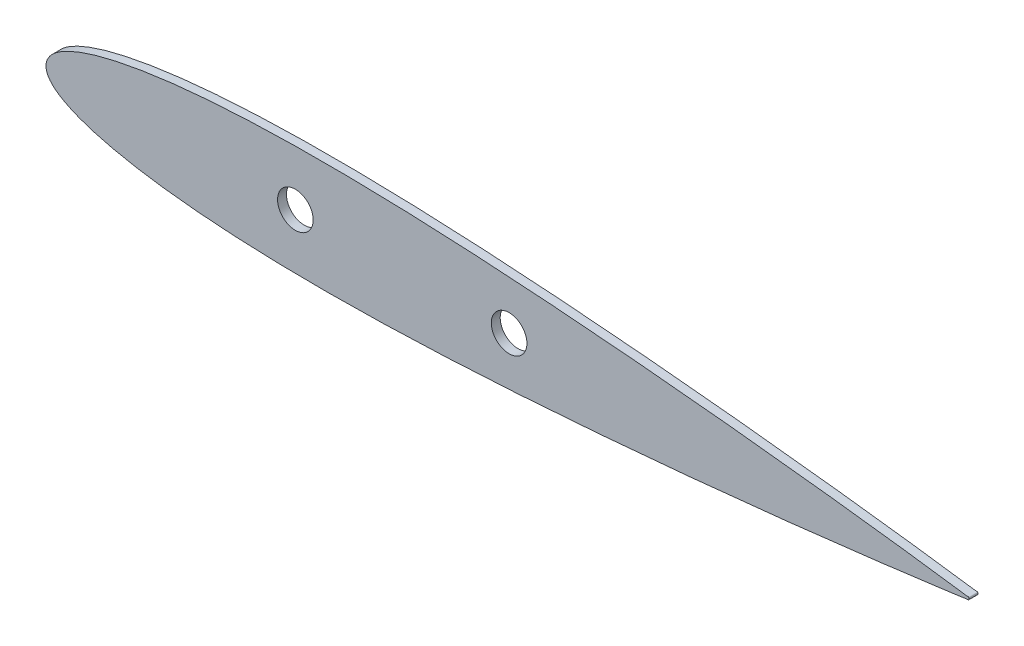
ISO-10303-21;
HEADER;
FILE_DESCRIPTION(('STEP AP214'),'2;1');
FILE_NAME('part.step','',(''),(''),'','','');
FILE_SCHEMA(('AUTOMOTIVE_DESIGN { 1 0 10303 214 1 1 1 1 }'));
ENDSEC;
DATA;
#1=APPLICATION_CONTEXT('core data for automotive mechanical design processes');
#2=APPLICATION_PROTOCOL_DEFINITION('international standard','automotive_design',2000,#1);
#3=PRODUCT_CONTEXT('',#1,'mechanical');
#4=PRODUCT('Part','Part','',(#3));
#5=PRODUCT_RELATED_PRODUCT_CATEGORY('part','',(#4));
#6=PRODUCT_DEFINITION_FORMATION('','',#4);
#7=PRODUCT_DEFINITION_CONTEXT('part definition',#1,'design');
#8=PRODUCT_DEFINITION('design','',#6,#7);
#9=PRODUCT_DEFINITION_SHAPE('','',#8);
#10=(LENGTH_UNIT() NAMED_UNIT(*) SI_UNIT(.MILLI.,.METRE.));
#11=(NAMED_UNIT(*) PLANE_ANGLE_UNIT() SI_UNIT($,.RADIAN.));
#12=(NAMED_UNIT(*) SI_UNIT($,.STERADIAN.) SOLID_ANGLE_UNIT());
#13=UNCERTAINTY_MEASURE_WITH_UNIT(LENGTH_MEASURE(1.E-05),#10,'distance_accuracy_value','');
#14=(GEOMETRIC_REPRESENTATION_CONTEXT(3) GLOBAL_UNCERTAINTY_ASSIGNED_CONTEXT((#13)) GLOBAL_UNIT_ASSIGNED_CONTEXT((#10,
#11,#12)) REPRESENTATION_CONTEXT('',''));
#15=CARTESIAN_POINT('',(0.,0.,0.));
#16=DIRECTION('',(0.,0.,1.));
#17=DIRECTION('',(1.,0.,0.));
#18=AXIS2_PLACEMENT_3D('',#15,#16,#17);
#19=CARTESIAN_POINT('',(328.93,0.4144518,-3.175));
#20=CARTESIAN_POINT('',(328.807900642059,0.516772716738785,-3.175));
#21=CARTESIAN_POINT('',(328.019000541414,0.420161926083877,-3.175));
#22=CARTESIAN_POINT('',(326.614170865217,0.81562281757267,-3.175));
#23=CARTESIAN_POINT('',(324.037900123935,1.06005378814123,-3.175));
#24=CARTESIAN_POINT('',(320.567272172125,1.58463263800138,-3.175));
#25=CARTESIAN_POINT('',(316.096583479428,2.17002759359815,-3.175));
#26=CARTESIAN_POINT('',(310.705215163691,2.89149996450729,-3.175));
#27=CARTESIAN_POINT('',(304.407193949017,3.70705593993522,-3.175));
#28=CARTESIAN_POINT('',(297.248126622141,4.61507177967288,-3.175));
#29=CARTESIAN_POINT('',(289.269853683397,5.59964054631903,-3.175));
#30=CARTESIAN_POINT('',(280.522284399234,6.64743751624183,-3.175));
#31=CARTESIAN_POINT('',(271.059187129676,7.74546694890819,-3.175));
#32=CARTESIAN_POINT('',(260.938835985917,8.87877944849764,-3.175));
#33=CARTESIAN_POINT('',(250.223661724068,10.0335381867959,-3.175));
#34=CARTESIAN_POINT('',(238.979802734982,11.1954009123511,-3.175));
#35=CARTESIAN_POINT('',(227.276553794182,12.349370833012,-3.175));
#36=CARTESIAN_POINT('',(215.186101230942,13.4792496774538,-3.175));
#37=CARTESIAN_POINT('',(202.782903290313,14.5702044680908,-3.175));
#38=CARTESIAN_POINT('',(190.143565404442,15.6039963934307,-3.175));
#39=CARTESIAN_POINT('',(177.345750776495,16.5637694348733,-3.175));
#40=CARTESIAN_POINT('',(164.468478458187,17.4317046401168,-3.175));
#41=CARTESIAN_POINT('',(151.591090460871,18.1896542328712,-3.175));
#42=CARTESIAN_POINT('',(138.79286291326,18.8184695721913,-3.175));
#43=CARTESIAN_POINT('',(126.152837259992,19.3013827120907,-3.175));
#44=CARTESIAN_POINT('',(113.748578815874,19.6226392129927,-3.175));
#45=CARTESIAN_POINT('',(101.656743366878,19.7665476907359,-3.175));
#46=CARTESIAN_POINT('',(89.9516302388674,19.7216875076689,-3.175));
#47=CARTESIAN_POINT('',(78.7054045061925,19.4793935567527,-3.175));
#48=CARTESIAN_POINT('',(67.9872918219324,19.0335239512091,-3.175));
#49=CARTESIAN_POINT('',(57.8632642238771,18.3829123656552,-3.175));
#50=CARTESIAN_POINT('',(48.3955443542978,17.5295164473678,-3.175));
#51=CARTESIAN_POINT('',(39.6420679190972,16.4800012550287,-3.175));
#52=CARTESIAN_POINT('',(31.6561901622278,15.2432966096517,-3.175));
#53=CARTESIAN_POINT('',(24.4863035711666,13.832318834266,-3.175));
#54=CARTESIAN_POINT('',(18.1744318378155,12.2630222312678,-3.175));
#55=CARTESIAN_POINT('',(12.7564417556825,10.5507093994903,-3.175));
#56=CARTESIAN_POINT('',(8.25986026912929,8.71132815482194,-3.175));
#57=CARTESIAN_POINT('',(4.69902710161782,6.75732277609648,-3.175));
#58=CARTESIAN_POINT('',(2.07942152666627,4.68483665935683,-3.175));
#59=CARTESIAN_POINT('',(0.401585468906275,2.44373165607489,-3.175));
#60=CARTESIAN_POINT('',(-0.187153106607009,0.,-3.175));
#61=CARTESIAN_POINT('',(0.40158546890627,-2.44373165607487,-3.175));
#62=CARTESIAN_POINT('',(2.07942152666625,-4.68483665935682,-3.175));
#63=CARTESIAN_POINT('',(4.69902710161788,-6.75732277609652,-3.175));
#64=CARTESIAN_POINT('',(8.25986026912924,-8.71132815482192,-3.175));
#65=CARTESIAN_POINT('',(12.7564417556825,-10.5507093994903,-3.175));
#66=CARTESIAN_POINT('',(18.1744318378155,-12.2630222312678,-3.175));
#67=CARTESIAN_POINT('',(24.4863035711665,-13.832318834266,-3.175));
#68=CARTESIAN_POINT('',(31.6561901622278,-15.2432966096517,-3.175));
#69=CARTESIAN_POINT('',(39.6420679190972,-16.4800012550287,-3.175));
#70=CARTESIAN_POINT('',(48.3955443542978,-17.5295164473678,-3.175));
#71=CARTESIAN_POINT('',(57.8632642238771,-18.3829123656552,-3.175));
#72=CARTESIAN_POINT('',(67.9872918219324,-19.0335239512091,-3.175));
#73=CARTESIAN_POINT('',(78.7054045061925,-19.4793935567527,-3.175));
#74=CARTESIAN_POINT('',(89.9516302388673,-19.7216875076689,-3.175));
#75=CARTESIAN_POINT('',(101.656743366878,-19.7665476907359,-3.175));
#76=CARTESIAN_POINT('',(113.748578815874,-19.6226392129927,-3.175));
#77=CARTESIAN_POINT('',(126.152837259992,-19.3013827120907,-3.175));
#78=CARTESIAN_POINT('',(138.792862913259,-18.8184695721913,-3.175));
#79=CARTESIAN_POINT('',(151.591090460871,-18.1896542328712,-3.175));
#80=CARTESIAN_POINT('',(164.468478458187,-17.4317046401169,-3.175));
#81=CARTESIAN_POINT('',(177.345750776495,-16.5637694348733,-3.175));
#82=CARTESIAN_POINT('',(190.143565404442,-15.6039963934307,-3.175));
#83=CARTESIAN_POINT('',(202.782903290314,-14.5702044680908,-3.175));
#84=CARTESIAN_POINT('',(215.186101230942,-13.4792496774538,-3.175));
#85=CARTESIAN_POINT('',(227.276553794182,-12.349370833012,-3.175));
#86=CARTESIAN_POINT('',(238.979802734982,-11.1954009123511,-3.175));
#87=CARTESIAN_POINT('',(250.223661724068,-10.0335381867959,-3.175));
#88=CARTESIAN_POINT('',(260.938835985917,-8.87877944849763,-3.175));
#89=CARTESIAN_POINT('',(271.059187129676,-7.74546694890819,-3.175));
#90=CARTESIAN_POINT('',(280.522284399234,-6.64743751624183,-3.175));
#91=CARTESIAN_POINT('',(289.269853683397,-5.59964054631902,-3.175));
#92=CARTESIAN_POINT('',(297.248126622141,-4.61507177967289,-3.175));
#93=CARTESIAN_POINT('',(304.407193949017,-3.70705593993522,-3.175));
#94=CARTESIAN_POINT('',(310.705215163691,-2.89149996450729,-3.175));
#95=CARTESIAN_POINT('',(316.096583479428,-2.17002759359815,-3.175));
#96=CARTESIAN_POINT('',(320.567272172125,-1.58463263800138,-3.175));
#97=CARTESIAN_POINT('',(324.037900123935,-1.06005378814123,-3.175));
#98=CARTESIAN_POINT('',(326.614170865217,-0.815622817572666,-3.175));
#99=CARTESIAN_POINT('',(328.019000541414,-0.420161926083893,-3.175));
#100=CARTESIAN_POINT('',(329.127736253696,-0.555940630768203,-3.175));
#101=CARTESIAN_POINT('',(329.127736253696,0.248746139529229,-3.175));
#102=CARTESIAN_POINT('',(328.93,0.4144518,-3.175));
#103=B_SPLINE_CURVE_WITH_KNOTS('',3,(#19,#20,#21,#22,#23,#24,#25,#26,#27,#28,#29,#30,#31,#32,
#33,#34,#35,#36,#37,#38,#39,#40,#41,#42,#43,#44,#45,#46,#47,#48,#49,#50,#51,#52,#53,#54,#55,#56,
#57,#58,#59,#60,#61,#62,#63,#64,#65,#66,#67,#68,#69,#70,#71,#72,#73,#74,#75,#76,#77,#78,#79,#80,
#81,#82,#83,#84,#85,#86,#87,#88,#89,#90,#91,#92,#93,#94,#95,#96,#97,#98,#99,#100,#101,#102),
.UNSPECIFIED.,.T.,.F.,(4,1,1,1,1,1,1,1,1,1,1,1,1,1,1,1,1,1,1,1,1,1,1,1,1,1,1,1,1,1,1,1,1,1,1,1,
1,1,1,1,1,1,1,1,1,1,1,1,1,1,1,1,1,1,1,1,1,1,1,1,1,1,1,1,1,1,1,1,1,1,1,1,1,1,1,1,1,1,1,1,1,4),
(0.,0.000762214651028602,0.00304470631082167,0.00683224554312916,0.0121011758037585,
0.0188175356586858,0.026939454793122,0.0364148482585568,0.0471846285955963,0.0591804130998148,
0.0723278736139124,0.0865440610891483,0.101740580336553,0.117823336433574,0.134691452208322,
0.152240154447155,0.170361289964637,0.188941007849542,0.207865435445639,0.227016078022501,
0.246275695980001,0.265524943249896,0.284644966110444,0.303520118268662,0.322034575374331,
0.340078352914118,0.357542593241702,0.374325481920834,0.390329890871888,0.405463889739095,
0.419643801445685,0.43279337139134,0.444843816743186,0.455737920704734,0.465428653233084,
0.473886320085416,0.481101634077568,0.487101684418678,0.491975368345093,0.495930677807379,
0.499382808099288,0.502834938391198,0.506790247853484,0.511663931779899,0.517663982121008,
0.524879296113161,0.533336962965492,0.543027695493843,0.553921799455391,0.565972244807237,
0.579121814752892,0.593301726459482,0.608435725326689,0.624440134277742,0.641223022956875,
0.658687263284458,0.676731040824245,0.695245497929915,0.714120650088133,0.733240672948681,
0.752489920218576,0.771749538176075,0.790900180752937,0.809824608349034,0.82840432623394,
0.846525461751422,0.864074163990254,0.880942279765002,0.897025035862024,0.912221555109428,
0.926437742584664,0.939585203098762,0.95158098760298,0.96235076794002,0.971826161405455,
0.979948080539891,0.986664440394818,0.991933370655447,0.995720909887755,0.998003401547548,
0.998765616198576,1.),.UNSPECIFIED.);
#104=DIRECTION('',(0.,0.,1.));
#105=VECTOR('',#104,1.);
#106=SURFACE_OF_LINEAR_EXTRUSION('',#103,#105);
#107=CARTESIAN_POINT('',(328.93,0.4144518,-3.175));
#108=VERTEX_POINT('',#107);
#109=EDGE_CURVE('E10',#108,#108,#103,.T.);
#110=ORIENTED_EDGE('',*,*,#109,.T.);
#111=EDGE_LOOP('',(#110));
#112=FACE_BOUND('',#111,.T.);
#113=CARTESIAN_POINT('',(328.93,0.4144518,0.));
#114=CARTESIAN_POINT('',(328.807900642059,0.516772716738785,0.));
#115=CARTESIAN_POINT('',(328.019000541414,0.420161926083877,0.));
#116=CARTESIAN_POINT('',(326.614170865217,0.81562281757267,0.));
#117=CARTESIAN_POINT('',(324.037900123935,1.06005378814123,0.));
#118=CARTESIAN_POINT('',(320.567272172125,1.58463263800138,0.));
#119=CARTESIAN_POINT('',(316.096583479428,2.17002759359815,0.));
#120=CARTESIAN_POINT('',(310.705215163691,2.89149996450729,0.));
#121=CARTESIAN_POINT('',(304.407193949017,3.70705593993522,0.));
#122=CARTESIAN_POINT('',(297.248126622141,4.61507177967288,0.));
#123=CARTESIAN_POINT('',(289.269853683397,5.59964054631903,0.));
#124=CARTESIAN_POINT('',(280.522284399234,6.64743751624183,0.));
#125=CARTESIAN_POINT('',(271.059187129676,7.74546694890819,0.));
#126=CARTESIAN_POINT('',(260.938835985917,8.87877944849764,0.));
#127=CARTESIAN_POINT('',(250.223661724068,10.0335381867959,0.));
#128=CARTESIAN_POINT('',(238.979802734982,11.1954009123511,0.));
#129=CARTESIAN_POINT('',(227.276553794182,12.349370833012,0.));
#130=CARTESIAN_POINT('',(215.186101230942,13.4792496774538,0.));
#131=CARTESIAN_POINT('',(202.782903290313,14.5702044680908,0.));
#132=CARTESIAN_POINT('',(190.143565404442,15.6039963934307,0.));
#133=CARTESIAN_POINT('',(177.345750776495,16.5637694348733,0.));
#134=CARTESIAN_POINT('',(164.468478458187,17.4317046401168,0.));
#135=CARTESIAN_POINT('',(151.591090460871,18.1896542328712,0.));
#136=CARTESIAN_POINT('',(138.79286291326,18.8184695721913,0.));
#137=CARTESIAN_POINT('',(126.152837259992,19.3013827120907,0.));
#138=CARTESIAN_POINT('',(113.748578815874,19.6226392129927,0.));
#139=CARTESIAN_POINT('',(101.656743366878,19.7665476907359,0.));
#140=CARTESIAN_POINT('',(89.9516302388674,19.7216875076689,0.));
#141=CARTESIAN_POINT('',(78.7054045061925,19.4793935567527,0.));
#142=CARTESIAN_POINT('',(67.9872918219324,19.0335239512091,0.));
#143=CARTESIAN_POINT('',(57.8632642238771,18.3829123656552,0.));
#144=CARTESIAN_POINT('',(48.3955443542978,17.5295164473678,0.));
#145=CARTESIAN_POINT('',(39.6420679190972,16.4800012550287,0.));
#146=CARTESIAN_POINT('',(31.6561901622278,15.2432966096517,0.));
#147=CARTESIAN_POINT('',(24.4863035711666,13.832318834266,0.));
#148=CARTESIAN_POINT('',(18.1744318378155,12.2630222312678,0.));
#149=CARTESIAN_POINT('',(12.7564417556825,10.5507093994903,0.));
#150=CARTESIAN_POINT('',(8.25986026912929,8.71132815482194,0.));
#151=CARTESIAN_POINT('',(4.69902710161782,6.75732277609648,0.));
#152=CARTESIAN_POINT('',(2.07942152666627,4.68483665935683,0.));
#153=CARTESIAN_POINT('',(0.401585468906275,2.44373165607489,0.));
#154=CARTESIAN_POINT('',(-0.187153106607009,0.,0.));
#155=CARTESIAN_POINT('',(0.40158546890627,-2.44373165607487,0.));
#156=CARTESIAN_POINT('',(2.07942152666625,-4.68483665935682,0.));
#157=CARTESIAN_POINT('',(4.69902710161788,-6.75732277609652,0.));
#158=CARTESIAN_POINT('',(8.25986026912924,-8.71132815482192,0.));
#159=CARTESIAN_POINT('',(12.7564417556825,-10.5507093994903,0.));
#160=CARTESIAN_POINT('',(18.1744318378155,-12.2630222312678,0.));
#161=CARTESIAN_POINT('',(24.4863035711665,-13.832318834266,0.));
#162=CARTESIAN_POINT('',(31.6561901622278,-15.2432966096517,0.));
#163=CARTESIAN_POINT('',(39.6420679190972,-16.4800012550287,0.));
#164=CARTESIAN_POINT('',(48.3955443542978,-17.5295164473678,0.));
#165=CARTESIAN_POINT('',(57.8632642238771,-18.3829123656552,0.));
#166=CARTESIAN_POINT('',(67.9872918219324,-19.0335239512091,0.));
#167=CARTESIAN_POINT('',(78.7054045061925,-19.4793935567527,0.));
#168=CARTESIAN_POINT('',(89.9516302388673,-19.7216875076689,0.));
#169=CARTESIAN_POINT('',(101.656743366878,-19.7665476907359,0.));
#170=CARTESIAN_POINT('',(113.748578815874,-19.6226392129927,0.));
#171=CARTESIAN_POINT('',(126.152837259992,-19.3013827120907,0.));
#172=CARTESIAN_POINT('',(138.792862913259,-18.8184695721913,0.));
#173=CARTESIAN_POINT('',(151.591090460871,-18.1896542328712,0.));
#174=CARTESIAN_POINT('',(164.468478458187,-17.4317046401169,0.));
#175=CARTESIAN_POINT('',(177.345750776495,-16.5637694348733,0.));
#176=CARTESIAN_POINT('',(190.143565404442,-15.6039963934307,0.));
#177=CARTESIAN_POINT('',(202.782903290314,-14.5702044680908,0.));
#178=CARTESIAN_POINT('',(215.186101230942,-13.4792496774538,0.));
#179=CARTESIAN_POINT('',(227.276553794182,-12.349370833012,0.));
#180=CARTESIAN_POINT('',(238.979802734982,-11.1954009123511,0.));
#181=CARTESIAN_POINT('',(250.223661724068,-10.0335381867959,0.));
#182=CARTESIAN_POINT('',(260.938835985917,-8.87877944849763,0.));
#183=CARTESIAN_POINT('',(271.059187129676,-7.74546694890819,0.));
#184=CARTESIAN_POINT('',(280.522284399234,-6.64743751624183,0.));
#185=CARTESIAN_POINT('',(289.269853683397,-5.59964054631902,0.));
#186=CARTESIAN_POINT('',(297.248126622141,-4.61507177967289,0.));
#187=CARTESIAN_POINT('',(304.407193949017,-3.70705593993522,0.));
#188=CARTESIAN_POINT('',(310.705215163691,-2.89149996450729,0.));
#189=CARTESIAN_POINT('',(316.096583479428,-2.17002759359815,0.));
#190=CARTESIAN_POINT('',(320.567272172125,-1.58463263800138,0.));
#191=CARTESIAN_POINT('',(324.037900123935,-1.06005378814123,0.));
#192=CARTESIAN_POINT('',(326.614170865217,-0.815622817572666,0.));
#193=CARTESIAN_POINT('',(328.019000541414,-0.420161926083893,0.));
#194=CARTESIAN_POINT('',(329.127736253696,-0.555940630768203,0.));
#195=CARTESIAN_POINT('',(329.127736253696,0.248746139529229,0.));
#196=CARTESIAN_POINT('',(328.93,0.4144518,0.));
#197=B_SPLINE_CURVE_WITH_KNOTS('',3,(#113,#114,#115,#116,#117,#118,#119,#120,#121,#122,#123,
#124,#125,#126,#127,#128,#129,#130,#131,#132,#133,#134,#135,#136,#137,#138,#139,#140,#141,#142,
#143,#144,#145,#146,#147,#148,#149,#150,#151,#152,#153,#154,#155,#156,#157,#158,#159,#160,#161,
#162,#163,#164,#165,#166,#167,#168,#169,#170,#171,#172,#173,#174,#175,#176,#177,#178,#179,#180,
#181,#182,#183,#184,#185,#186,#187,#188,#189,#190,#191,#192,#193,#194,#195,#196),.UNSPECIFIED.,
.T.,.F.,(4,1,1,1,1,1,1,1,1,1,1,1,1,1,1,1,1,1,1,1,1,1,1,1,1,1,1,1,1,1,1,1,1,1,1,1,1,1,1,1,1,1,1,
1,1,1,1,1,1,1,1,1,1,1,1,1,1,1,1,1,1,1,1,1,1,1,1,1,1,1,1,1,1,1,1,1,1,1,1,1,1,4),(0.,
0.000762214651028602,0.00304470631082167,0.00683224554312916,0.0121011758037585,
0.0188175356586858,0.026939454793122,0.0364148482585568,0.0471846285955963,0.0591804130998148,
0.0723278736139124,0.0865440610891483,0.101740580336553,0.117823336433574,0.134691452208322,
0.152240154447155,0.170361289964637,0.188941007849542,0.207865435445639,0.227016078022501,
0.246275695980001,0.265524943249896,0.284644966110444,0.303520118268662,0.322034575374331,
0.340078352914118,0.357542593241702,0.374325481920834,0.390329890871888,0.405463889739095,
0.419643801445685,0.43279337139134,0.444843816743186,0.455737920704734,0.465428653233084,
0.473886320085416,0.481101634077568,0.487101684418678,0.491975368345093,0.495930677807379,
0.499382808099288,0.502834938391198,0.506790247853484,0.511663931779899,0.517663982121008,
0.524879296113161,0.533336962965492,0.543027695493843,0.553921799455391,0.565972244807237,
0.579121814752892,0.593301726459482,0.608435725326689,0.624440134277742,0.641223022956875,
0.658687263284458,0.676731040824245,0.695245497929915,0.714120650088133,0.733240672948681,
0.752489920218576,0.771749538176075,0.790900180752937,0.809824608349034,0.82840432623394,
0.846525461751422,0.864074163990254,0.880942279765002,0.897025035862024,0.912221555109428,
0.926437742584664,0.939585203098762,0.95158098760298,0.96235076794002,0.971826161405455,
0.979948080539891,0.986664440394818,0.991933370655447,0.995720909887755,0.998003401547548,
0.998765616198576,1.),.UNSPECIFIED.);
#198=CARTESIAN_POINT('',(328.93,0.4144518,0.));
#199=VERTEX_POINT('',#198);
#200=EDGE_CURVE('E39',#199,#199,#197,.T.);
#201=ORIENTED_EDGE('',*,*,#200,.F.);
#202=EDGE_LOOP('',(#201));
#203=FACE_BOUND('',#202,.T.);
#204=ADVANCED_FACE('F35',(#112,#203),#106,.T.);
#205=CARTESIAN_POINT('',(0.0176347884834109,-0.416269351452418,-3.175));
#206=DIRECTION('',(0.,0.,1.));
#207=DIRECTION('',(-1.,0.,0.));
#208=AXIS2_PLACEMENT_3D('',#205,#206,#207);
#209=PLANE('',#208);
#210=CARTESIAN_POINT('',(88.9,0.,-3.175));
#211=DIRECTION('',(0.,0.,1.));
#212=DIRECTION('',(1.,0.,0.));
#213=AXIS2_PLACEMENT_3D('',#210,#211,#212);
#214=CIRCLE('',#213,6.35);
#215=CARTESIAN_POINT('',(95.25,0.,-3.175));
#216=VERTEX_POINT('',#215);
#217=EDGE_CURVE('E61',#216,#216,#214,.T.);
#218=ORIENTED_EDGE('',*,*,#217,.T.);
#219=EDGE_LOOP('',(#218));
#220=FACE_BOUND('',#219,.T.);
#221=CARTESIAN_POINT('',(165.1,0.,-3.175));
#222=DIRECTION('',(0.,0.,1.));
#223=DIRECTION('',(1.,0.,0.));
#224=AXIS2_PLACEMENT_3D('',#221,#222,#223);
#225=CIRCLE('',#224,6.35);
#226=CARTESIAN_POINT('',(171.45,0.,-3.175));
#227=VERTEX_POINT('',#226);
#228=EDGE_CURVE('E52',#227,#227,#225,.T.);
#229=ORIENTED_EDGE('',*,*,#228,.T.);
#230=EDGE_LOOP('',(#229));
#231=FACE_BOUND('',#230,.T.);
#232=ORIENTED_EDGE('',*,*,#109,.F.);
#233=EDGE_LOOP('',(#232));
#234=FACE_BOUND('',#233,.T.);
#235=ADVANCED_FACE('F74',(#220,#231,#234),#209,.F.);
#236=CARTESIAN_POINT('',(0.0176347884834109,-0.416269351452418,0.));
#237=DIRECTION('',(0.,0.,1.));
#238=DIRECTION('',(-1.,0.,0.));
#239=AXIS2_PLACEMENT_3D('',#236,#237,#238);
#240=PLANE('',#239);
#241=CARTESIAN_POINT('',(88.9,0.,0.));
#242=DIRECTION('',(0.,0.,1.));
#243=DIRECTION('',(1.,0.,0.));
#244=AXIS2_PLACEMENT_3D('',#241,#242,#243);
#245=CIRCLE('',#244,6.35);
#246=CARTESIAN_POINT('',(95.25,0.,0.));
#247=VERTEX_POINT('',#246);
#248=EDGE_CURVE('E47',#247,#247,#245,.T.);
#249=ORIENTED_EDGE('',*,*,#248,.F.);
#250=EDGE_LOOP('',(#249));
#251=FACE_BOUND('',#250,.T.);
#252=CARTESIAN_POINT('',(165.1,0.,0.));
#253=DIRECTION('',(0.,0.,1.));
#254=DIRECTION('',(1.,0.,0.));
#255=AXIS2_PLACEMENT_3D('',#252,#253,#254);
#256=CIRCLE('',#255,6.35);
#257=CARTESIAN_POINT('',(171.45,0.,0.));
#258=VERTEX_POINT('',#257);
#259=EDGE_CURVE('E58',#258,#258,#256,.T.);
#260=ORIENTED_EDGE('',*,*,#259,.F.);
#261=EDGE_LOOP('',(#260));
#262=FACE_BOUND('',#261,.T.);
#263=ORIENTED_EDGE('',*,*,#200,.T.);
#264=EDGE_LOOP('',(#263));
#265=FACE_BOUND('',#264,.T.);
#266=ADVANCED_FACE('F70',(#251,#262,#265),#240,.T.);
#267=CARTESIAN_POINT('',(165.1,0.,0.));
#268=DIRECTION('',(0.,0.,-1.));
#269=DIRECTION('',(1.,0.,0.));
#270=AXIS2_PLACEMENT_3D('',#267,#268,#269);
#271=CYLINDRICAL_SURFACE('',#270,6.35);
#272=ORIENTED_EDGE('',*,*,#259,.T.);
#273=EDGE_LOOP('',(#272));
#274=FACE_BOUND('',#273,.T.);
#275=ORIENTED_EDGE('',*,*,#228,.F.);
#276=EDGE_LOOP('',(#275));
#277=FACE_BOUND('',#276,.T.);
#278=ADVANCED_FACE('F73',(#274,#277),#271,.F.);
#279=CARTESIAN_POINT('',(88.9,0.,0.));
#280=DIRECTION('',(0.,0.,-1.));
#281=DIRECTION('',(1.,0.,0.));
#282=AXIS2_PLACEMENT_3D('',#279,#280,#281);
#283=CYLINDRICAL_SURFACE('',#282,6.35);
#284=ORIENTED_EDGE('',*,*,#248,.T.);
#285=EDGE_LOOP('',(#284));
#286=FACE_BOUND('',#285,.T.);
#287=ORIENTED_EDGE('',*,*,#217,.F.);
#288=EDGE_LOOP('',(#287));
#289=FACE_BOUND('',#288,.T.);
#290=ADVANCED_FACE('F67',(#286,#289),#283,.F.);
#291=CLOSED_SHELL('',(#204,#235,#266,#278,#290));
#292=MANIFOLD_SOLID_BREP('B2',#291);
#293=ADVANCED_BREP_SHAPE_REPRESENTATION('',(#18,#292),#14);
#294=SHAPE_DEFINITION_REPRESENTATION(#9,#293);
ENDSEC;
END-ISO-10303-21;
